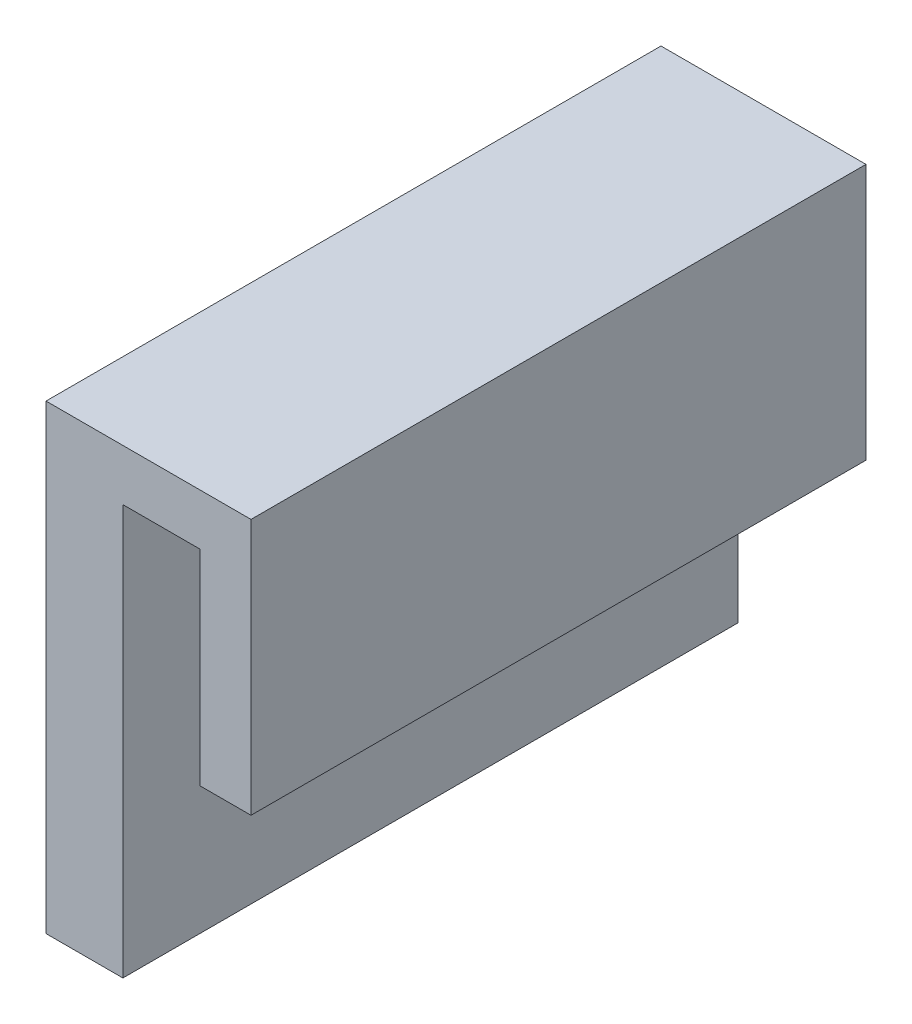
ISO-10303-21;
HEADER;
FILE_DESCRIPTION(('STEP AP214'),'2;1');
FILE_NAME('part.step','',(''),(''),'','','');
FILE_SCHEMA(('AUTOMOTIVE_DESIGN { 1 0 10303 214 1 1 1 1 }'));
ENDSEC;
DATA;
#1=APPLICATION_CONTEXT('core data for automotive mechanical design processes');
#2=APPLICATION_PROTOCOL_DEFINITION('international standard','automotive_design',2000,#1);
#3=PRODUCT_CONTEXT('',#1,'mechanical');
#4=PRODUCT('Part','Part','',(#3));
#5=PRODUCT_RELATED_PRODUCT_CATEGORY('part','',(#4));
#6=PRODUCT_DEFINITION_FORMATION('','',#4);
#7=PRODUCT_DEFINITION_CONTEXT('part definition',#1,'design');
#8=PRODUCT_DEFINITION('design','',#6,#7);
#9=PRODUCT_DEFINITION_SHAPE('','',#8);
#10=(LENGTH_UNIT() NAMED_UNIT(*) SI_UNIT(.MILLI.,.METRE.));
#11=(NAMED_UNIT(*) PLANE_ANGLE_UNIT() SI_UNIT($,.RADIAN.));
#12=(NAMED_UNIT(*) SI_UNIT($,.STERADIAN.) SOLID_ANGLE_UNIT());
#13=UNCERTAINTY_MEASURE_WITH_UNIT(LENGTH_MEASURE(1.E-05),#10,'distance_accuracy_value','');
#14=(GEOMETRIC_REPRESENTATION_CONTEXT(3) GLOBAL_UNCERTAINTY_ASSIGNED_CONTEXT((#13)) GLOBAL_UNIT_ASSIGNED_CONTEXT((#10,
#11,#12)) REPRESENTATION_CONTEXT('',''));
#15=CARTESIAN_POINT('',(0.,0.,0.));
#16=DIRECTION('',(0.,0.,1.));
#17=DIRECTION('',(1.,0.,0.));
#18=AXIS2_PLACEMENT_3D('',#15,#16,#17);
#19=CARTESIAN_POINT('',(0.,0.,12.));
#20=DIRECTION('',(1.,0.,0.));
#21=DIRECTION('',(0.,1.,0.));
#22=AXIS2_PLACEMENT_3D('',#19,#20,#21);
#23=PLANE('',#22);
#24=DIRECTION('',(0.,-1.,0.));
#25=VECTOR('',#24,1.);
#26=CARTESIAN_POINT('',(0.,0.,0.));
#27=LINE('',#26,#25);
#28=CARTESIAN_POINT('',(0.,1.,0.));
#29=VERTEX_POINT('',#28);
#30=CARTESIAN_POINT('',(0.,-8.,0.));
#31=VERTEX_POINT('',#30);
#32=EDGE_CURVE('E92',#29,#31,#27,.T.);
#33=ORIENTED_EDGE('',*,*,#32,.T.);
#34=DIRECTION('',(0.,0.,-1.));
#35=VECTOR('',#34,1.);
#36=CARTESIAN_POINT('',(0.,-8.,12.));
#37=LINE('',#36,#35);
#38=CARTESIAN_POINT('',(0.,-8.,12.));
#39=VERTEX_POINT('',#38);
#40=EDGE_CURVE('E11',#39,#31,#37,.T.);
#41=ORIENTED_EDGE('',*,*,#40,.F.);
#42=DIRECTION('',(0.,-1.,0.));
#43=VECTOR('',#42,1.);
#44=CARTESIAN_POINT('',(0.,1.,12.));
#45=LINE('',#44,#43);
#46=CARTESIAN_POINT('',(0.,1.,12.));
#47=VERTEX_POINT('',#46);
#48=EDGE_CURVE('E98',#47,#39,#45,.T.);
#49=ORIENTED_EDGE('',*,*,#48,.F.);
#50=DIRECTION('',(0.,0.,-1.));
#51=VECTOR('',#50,1.);
#52=CARTESIAN_POINT('',(0.,1.,12.));
#53=LINE('',#52,#51);
#54=EDGE_CURVE('E136',#47,#29,#53,.T.);
#55=ORIENTED_EDGE('',*,*,#54,.T.);
#56=EDGE_LOOP('',(#33,#41,#49,#55));
#57=FACE_BOUND('',#56,.T.);
#58=ADVANCED_FACE('F39',(#57),#23,.F.);
#59=CARTESIAN_POINT('',(0.,-8.,12.));
#60=DIRECTION('',(0.,1.,0.));
#61=DIRECTION('',(0.,0.,1.));
#62=AXIS2_PLACEMENT_3D('',#59,#60,#61);
#63=PLANE('',#62);
#64=DIRECTION('',(1.,0.,0.));
#65=VECTOR('',#64,1.);
#66=CARTESIAN_POINT('',(0.,-8.,0.));
#67=LINE('',#66,#65);
#68=CARTESIAN_POINT('',(1.5,-8.,0.));
#69=VERTEX_POINT('',#68);
#70=EDGE_CURVE('E142',#31,#69,#67,.T.);
#71=ORIENTED_EDGE('',*,*,#70,.T.);
#72=DIRECTION('',(0.,0.,-1.));
#73=VECTOR('',#72,1.);
#74=CARTESIAN_POINT('',(1.5,-8.,12.));
#75=LINE('',#74,#73);
#76=CARTESIAN_POINT('',(1.5,-8.,12.));
#77=VERTEX_POINT('',#76);
#78=EDGE_CURVE('E48',#77,#69,#75,.T.);
#79=ORIENTED_EDGE('',*,*,#78,.F.);
#80=DIRECTION('',(1.,0.,0.));
#81=VECTOR('',#80,1.);
#82=CARTESIAN_POINT('',(0.,-8.,12.));
#83=LINE('',#82,#81);
#84=EDGE_CURVE('E202',#39,#77,#83,.T.);
#85=ORIENTED_EDGE('',*,*,#84,.F.);
#86=ORIENTED_EDGE('',*,*,#40,.T.);
#87=EDGE_LOOP('',(#71,#79,#85,#86));
#88=FACE_BOUND('',#87,.T.);
#89=ADVANCED_FACE('F206',(#88),#63,.F.);
#90=CARTESIAN_POINT('',(1.5,-8.,12.));
#91=DIRECTION('',(-1.,0.,0.));
#92=DIRECTION('',(0.,0.,1.));
#93=AXIS2_PLACEMENT_3D('',#90,#91,#92);
#94=PLANE('',#93);
#95=DIRECTION('',(0.,1.,0.));
#96=VECTOR('',#95,1.);
#97=CARTESIAN_POINT('',(1.5,-8.,0.));
#98=LINE('',#97,#96);
#99=CARTESIAN_POINT('',(1.5,0.,0.));
#100=VERTEX_POINT('',#99);
#101=EDGE_CURVE('E145',#69,#100,#98,.T.);
#102=ORIENTED_EDGE('',*,*,#101,.T.);
#103=DIRECTION('',(0.,0.,-1.));
#104=VECTOR('',#103,1.);
#105=CARTESIAN_POINT('',(1.5,0.,12.));
#106=LINE('',#105,#104);
#107=CARTESIAN_POINT('',(1.5,0.,12.));
#108=VERTEX_POINT('',#107);
#109=EDGE_CURVE('E172',#108,#100,#106,.T.);
#110=ORIENTED_EDGE('',*,*,#109,.F.);
#111=DIRECTION('',(0.,1.,0.));
#112=VECTOR('',#111,1.);
#113=CARTESIAN_POINT('',(1.5,-8.,12.));
#114=LINE('',#113,#112);
#115=EDGE_CURVE('E183',#77,#108,#114,.T.);
#116=ORIENTED_EDGE('',*,*,#115,.F.);
#117=ORIENTED_EDGE('',*,*,#78,.T.);
#118=EDGE_LOOP('',(#102,#110,#116,#117));
#119=FACE_BOUND('',#118,.T.);
#120=ADVANCED_FACE('F181',(#119),#94,.F.);
#121=CARTESIAN_POINT('',(1.5,0.,12.));
#122=DIRECTION('',(0.,1.,0.));
#123=DIRECTION('',(0.,0.,1.));
#124=AXIS2_PLACEMENT_3D('',#121,#122,#123);
#125=PLANE('',#124);
#126=DIRECTION('',(1.,0.,0.));
#127=VECTOR('',#126,1.);
#128=CARTESIAN_POINT('',(1.5,0.,0.));
#129=LINE('',#128,#127);
#130=CARTESIAN_POINT('',(3.,0.,0.));
#131=VERTEX_POINT('',#130);
#132=EDGE_CURVE('E148',#100,#131,#129,.T.);
#133=ORIENTED_EDGE('',*,*,#132,.T.);
#134=DIRECTION('',(0.,0.,-1.));
#135=VECTOR('',#134,1.);
#136=CARTESIAN_POINT('',(3.,0.,12.));
#137=LINE('',#136,#135);
#138=CARTESIAN_POINT('',(3.,0.,12.));
#139=VERTEX_POINT('',#138);
#140=EDGE_CURVE('E168',#139,#131,#137,.T.);
#141=ORIENTED_EDGE('',*,*,#140,.F.);
#142=DIRECTION('',(1.,0.,0.));
#143=VECTOR('',#142,1.);
#144=CARTESIAN_POINT('',(1.5,0.,12.));
#145=LINE('',#144,#143);
#146=EDGE_CURVE('E196',#108,#139,#145,.T.);
#147=ORIENTED_EDGE('',*,*,#146,.F.);
#148=ORIENTED_EDGE('',*,*,#109,.T.);
#149=EDGE_LOOP('',(#133,#141,#147,#148));
#150=FACE_BOUND('',#149,.T.);
#151=ADVANCED_FACE('F191',(#150),#125,.F.);
#152=CARTESIAN_POINT('',(3.,0.,12.));
#153=DIRECTION('',(1.,0.,0.));
#154=DIRECTION('',(0.,0.,-1.));
#155=AXIS2_PLACEMENT_3D('',#152,#153,#154);
#156=PLANE('',#155);
#157=DIRECTION('',(0.,-1.,0.));
#158=VECTOR('',#157,1.);
#159=CARTESIAN_POINT('',(3.,0.,0.));
#160=LINE('',#159,#158);
#161=CARTESIAN_POINT('',(3.,-4.,0.));
#162=VERTEX_POINT('',#161);
#163=EDGE_CURVE('E151',#131,#162,#160,.T.);
#164=ORIENTED_EDGE('',*,*,#163,.T.);
#165=DIRECTION('',(0.,0.,-1.));
#166=VECTOR('',#165,1.);
#167=CARTESIAN_POINT('',(3.,-4.,12.));
#168=LINE('',#167,#166);
#169=CARTESIAN_POINT('',(3.,-4.,12.));
#170=VERTEX_POINT('',#169);
#171=EDGE_CURVE('E129',#170,#162,#168,.T.);
#172=ORIENTED_EDGE('',*,*,#171,.F.);
#173=DIRECTION('',(0.,-1.,0.));
#174=VECTOR('',#173,1.);
#175=CARTESIAN_POINT('',(3.,0.,12.));
#176=LINE('',#175,#174);
#177=EDGE_CURVE('E118',#139,#170,#176,.T.);
#178=ORIENTED_EDGE('',*,*,#177,.F.);
#179=ORIENTED_EDGE('',*,*,#140,.T.);
#180=EDGE_LOOP('',(#164,#172,#178,#179));
#181=FACE_BOUND('',#180,.T.);
#182=ADVANCED_FACE('F194',(#181),#156,.F.);
#183=CARTESIAN_POINT('',(3.,-4.,12.));
#184=DIRECTION('',(0.,1.,0.));
#185=DIRECTION('',(0.,0.,1.));
#186=AXIS2_PLACEMENT_3D('',#183,#184,#185);
#187=PLANE('',#186);
#188=DIRECTION('',(1.,0.,0.));
#189=VECTOR('',#188,1.);
#190=CARTESIAN_POINT('',(3.,-4.,0.));
#191=LINE('',#190,#189);
#192=CARTESIAN_POINT('',(4.,-4.,0.));
#193=VERTEX_POINT('',#192);
#194=EDGE_CURVE('E127',#162,#193,#191,.T.);
#195=ORIENTED_EDGE('',*,*,#194,.T.);
#196=DIRECTION('',(0.,0.,-1.));
#197=VECTOR('',#196,1.);
#198=CARTESIAN_POINT('',(4.,-4.,12.));
#199=LINE('',#198,#197);
#200=CARTESIAN_POINT('',(4.,-4.,12.));
#201=VERTEX_POINT('',#200);
#202=EDGE_CURVE('E124',#201,#193,#199,.T.);
#203=ORIENTED_EDGE('',*,*,#202,.F.);
#204=DIRECTION('',(1.,0.,0.));
#205=VECTOR('',#204,1.);
#206=CARTESIAN_POINT('',(3.,-4.,12.));
#207=LINE('',#206,#205);
#208=EDGE_CURVE('E112',#170,#201,#207,.T.);
#209=ORIENTED_EDGE('',*,*,#208,.F.);
#210=ORIENTED_EDGE('',*,*,#171,.T.);
#211=EDGE_LOOP('',(#195,#203,#209,#210));
#212=FACE_BOUND('',#211,.T.);
#213=ADVANCED_FACE('F125',(#212),#187,.F.);
#214=CARTESIAN_POINT('',(4.,-4.,12.));
#215=DIRECTION('',(-1.,0.,0.));
#216=DIRECTION('',(0.,0.,1.));
#217=AXIS2_PLACEMENT_3D('',#214,#215,#216);
#218=PLANE('',#217);
#219=DIRECTION('',(0.,1.,0.));
#220=VECTOR('',#219,1.);
#221=CARTESIAN_POINT('',(4.,-4.,0.));
#222=LINE('',#221,#220);
#223=CARTESIAN_POINT('',(4.,1.,0.));
#224=VERTEX_POINT('',#223);
#225=EDGE_CURVE('E85',#193,#224,#222,.T.);
#226=ORIENTED_EDGE('',*,*,#225,.T.);
#227=DIRECTION('',(0.,0.,-1.));
#228=VECTOR('',#227,1.);
#229=CARTESIAN_POINT('',(4.,1.,12.));
#230=LINE('',#229,#228);
#231=CARTESIAN_POINT('',(4.,1.,12.));
#232=VERTEX_POINT('',#231);
#233=EDGE_CURVE('E130',#232,#224,#230,.T.);
#234=ORIENTED_EDGE('',*,*,#233,.F.);
#235=DIRECTION('',(0.,1.,0.));
#236=VECTOR('',#235,1.);
#237=CARTESIAN_POINT('',(4.,-4.,12.));
#238=LINE('',#237,#236);
#239=EDGE_CURVE('E116',#201,#232,#238,.T.);
#240=ORIENTED_EDGE('',*,*,#239,.F.);
#241=ORIENTED_EDGE('',*,*,#202,.T.);
#242=EDGE_LOOP('',(#226,#234,#240,#241));
#243=FACE_BOUND('',#242,.T.);
#244=ADVANCED_FACE('F132',(#243),#218,.F.);
#245=CARTESIAN_POINT('',(4.,1.,12.));
#246=DIRECTION('',(0.,-1.,0.));
#247=DIRECTION('',(0.,0.,-1.));
#248=AXIS2_PLACEMENT_3D('',#245,#246,#247);
#249=PLANE('',#248);
#250=DIRECTION('',(-1.,0.,0.));
#251=VECTOR('',#250,1.);
#252=CARTESIAN_POINT('',(4.,1.,0.));
#253=LINE('',#252,#251);
#254=EDGE_CURVE('E158',#224,#29,#253,.T.);
#255=ORIENTED_EDGE('',*,*,#254,.T.);
#256=ORIENTED_EDGE('',*,*,#54,.F.);
#257=DIRECTION('',(-1.,0.,0.));
#258=VECTOR('',#257,1.);
#259=CARTESIAN_POINT('',(4.,1.,12.));
#260=LINE('',#259,#258);
#261=EDGE_CURVE('E56',#232,#47,#260,.T.);
#262=ORIENTED_EDGE('',*,*,#261,.F.);
#263=ORIENTED_EDGE('',*,*,#233,.T.);
#264=EDGE_LOOP('',(#255,#256,#262,#263));
#265=FACE_BOUND('',#264,.T.);
#266=ADVANCED_FACE('F209',(#265),#249,.F.);
#267=CARTESIAN_POINT('',(0.,0.,12.));
#268=DIRECTION('',(0.,0.,1.));
#269=DIRECTION('',(1.,0.,0.));
#270=AXIS2_PLACEMENT_3D('',#267,#268,#269);
#271=PLANE('',#270);
#272=ORIENTED_EDGE('',*,*,#48,.T.);
#273=ORIENTED_EDGE('',*,*,#84,.T.);
#274=ORIENTED_EDGE('',*,*,#115,.T.);
#275=ORIENTED_EDGE('',*,*,#146,.T.);
#276=ORIENTED_EDGE('',*,*,#177,.T.);
#277=ORIENTED_EDGE('',*,*,#208,.T.);
#278=ORIENTED_EDGE('',*,*,#239,.T.);
#279=ORIENTED_EDGE('',*,*,#261,.T.);
#280=EDGE_LOOP('',(#272,#273,#274,#275,#276,#277,#278,#279));
#281=FACE_BOUND('',#280,.T.);
#282=ADVANCED_FACE('F114',(#281),#271,.T.);
#283=CARTESIAN_POINT('',(0.,0.,0.));
#284=DIRECTION('',(0.,0.,1.));
#285=DIRECTION('',(1.,0.,0.));
#286=AXIS2_PLACEMENT_3D('',#283,#284,#285);
#287=PLANE('',#286);
#288=ORIENTED_EDGE('',*,*,#32,.F.);
#289=ORIENTED_EDGE('',*,*,#254,.F.);
#290=ORIENTED_EDGE('',*,*,#225,.F.);
#291=ORIENTED_EDGE('',*,*,#194,.F.);
#292=ORIENTED_EDGE('',*,*,#163,.F.);
#293=ORIENTED_EDGE('',*,*,#132,.F.);
#294=ORIENTED_EDGE('',*,*,#101,.F.);
#295=ORIENTED_EDGE('',*,*,#70,.F.);
#296=EDGE_LOOP('',(#288,#289,#290,#291,#292,#293,#294,#295));
#297=FACE_BOUND('',#296,.T.);
#298=ADVANCED_FACE('F187',(#297),#287,.F.);
#299=CLOSED_SHELL('',(#58,#89,#120,#151,#182,#213,#244,#266,#282,#298));
#300=MANIFOLD_SOLID_BREP('B2',#299);
#301=ADVANCED_BREP_SHAPE_REPRESENTATION('',(#18,#300),#14);
#302=SHAPE_DEFINITION_REPRESENTATION(#9,#301);
ENDSEC;
END-ISO-10303-21;
